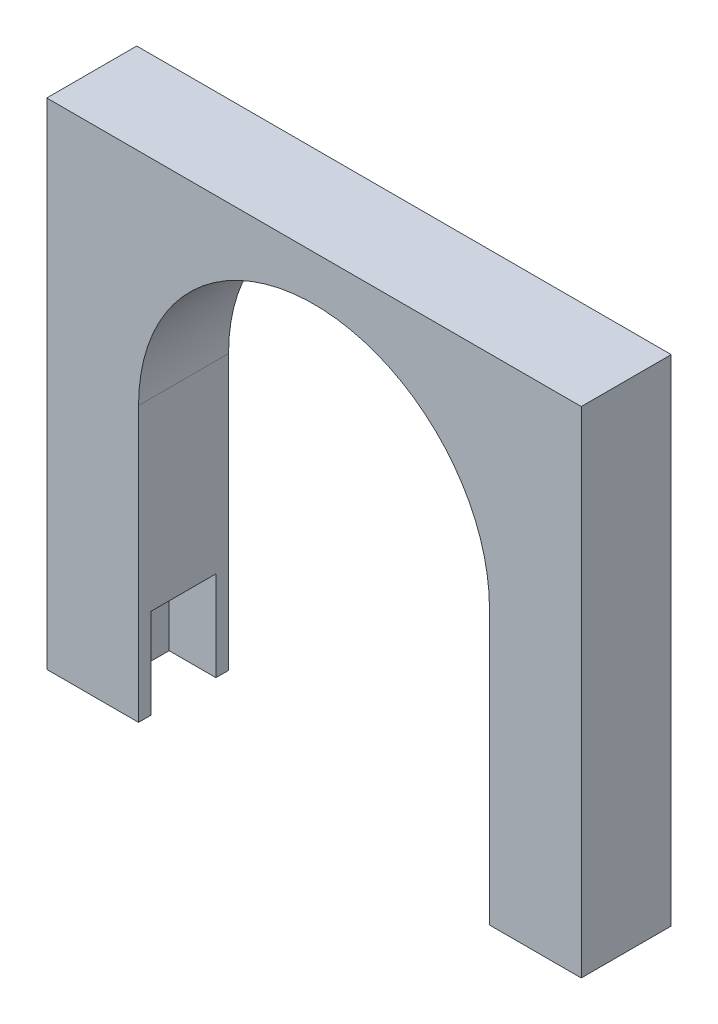
ISO-10303-21;
HEADER;
FILE_DESCRIPTION(('STEP AP214'),'2;1');
FILE_NAME('part.step','',(''),(''),'','','');
FILE_SCHEMA(('AUTOMOTIVE_DESIGN { 1 0 10303 214 1 1 1 1 }'));
ENDSEC;
DATA;
#1=APPLICATION_CONTEXT('core data for automotive mechanical design processes');
#2=APPLICATION_PROTOCOL_DEFINITION('international standard','automotive_design',2000,#1);
#3=PRODUCT_CONTEXT('',#1,'mechanical');
#4=PRODUCT('Part','Part','',(#3));
#5=PRODUCT_RELATED_PRODUCT_CATEGORY('part','',(#4));
#6=PRODUCT_DEFINITION_FORMATION('','',#4);
#7=PRODUCT_DEFINITION_CONTEXT('part definition',#1,'design');
#8=PRODUCT_DEFINITION('design','',#6,#7);
#9=PRODUCT_DEFINITION_SHAPE('','',#8);
#10=(LENGTH_UNIT() NAMED_UNIT(*) SI_UNIT(.MILLI.,.METRE.));
#11=(NAMED_UNIT(*) PLANE_ANGLE_UNIT() SI_UNIT($,.RADIAN.));
#12=(NAMED_UNIT(*) SI_UNIT($,.STERADIAN.) SOLID_ANGLE_UNIT());
#13=UNCERTAINTY_MEASURE_WITH_UNIT(LENGTH_MEASURE(1.E-05),#10,'distance_accuracy_value','');
#14=(GEOMETRIC_REPRESENTATION_CONTEXT(3) GLOBAL_UNCERTAINTY_ASSIGNED_CONTEXT((#13)) GLOBAL_UNIT_ASSIGNED_CONTEXT((#10,
#11,#12)) REPRESENTATION_CONTEXT('',''));
#15=CARTESIAN_POINT('',(0.,0.,0.));
#16=DIRECTION('',(0.,0.,1.));
#17=DIRECTION('',(1.,0.,0.));
#18=AXIS2_PLACEMENT_3D('',#15,#16,#17);
#19=CARTESIAN_POINT('',(-19.5,0.,10.));
#20=DIRECTION('',(-1.,0.,0.));
#21=DIRECTION('',(0.,0.,1.));
#22=AXIS2_PLACEMENT_3D('',#19,#20,#21);
#23=PLANE('',#22);
#24=DIRECTION('',(0.,0.,-1.));
#25=VECTOR('',#24,1.);
#26=CARTESIAN_POINT('',(-19.5,0.,10.));
#27=LINE('',#26,#25);
#28=CARTESIAN_POINT('',(-19.5,0.,10.));
#29=VERTEX_POINT('',#28);
#30=CARTESIAN_POINT('',(-19.5,0.,8.6));
#31=VERTEX_POINT('',#30);
#32=EDGE_CURVE('E241',#29,#31,#27,.T.);
#33=ORIENTED_EDGE('',*,*,#32,.T.);
#34=DIRECTION('',(0.,-1.,0.));
#35=VECTOR('',#34,1.);
#36=CARTESIAN_POINT('',(-19.5,10.,8.6));
#37=LINE('',#36,#35);
#38=CARTESIAN_POINT('',(-19.5,10.,8.6));
#39=VERTEX_POINT('',#38);
#40=EDGE_CURVE('E198',#39,#31,#37,.T.);
#41=ORIENTED_EDGE('',*,*,#40,.F.);
#42=DIRECTION('',(0.,0.,1.));
#43=VECTOR('',#42,1.);
#44=CARTESIAN_POINT('',(-19.5,10.,1.4));
#45=LINE('',#44,#43);
#46=CARTESIAN_POINT('',(-19.5,10.,1.4));
#47=VERTEX_POINT('',#46);
#48=EDGE_CURVE('E184',#47,#39,#45,.T.);
#49=ORIENTED_EDGE('',*,*,#48,.F.);
#50=DIRECTION('',(0.,-1.,0.));
#51=VECTOR('',#50,1.);
#52=CARTESIAN_POINT('',(-19.5,10.,1.4));
#53=LINE('',#52,#51);
#54=CARTESIAN_POINT('',(-19.5,0.,1.4));
#55=VERTEX_POINT('',#54);
#56=EDGE_CURVE('E200',#47,#55,#53,.T.);
#57=ORIENTED_EDGE('',*,*,#56,.T.);
#58=CARTESIAN_POINT('',(-19.5,0.,0.));
#59=VERTEX_POINT('',#58);
#60=EDGE_CURVE('E222',#55,#59,#27,.T.);
#61=ORIENTED_EDGE('',*,*,#60,.T.);
#62=DIRECTION('',(0.,1.,0.));
#63=VECTOR('',#62,1.);
#64=CARTESIAN_POINT('',(-19.5,0.,0.));
#65=LINE('',#64,#63);
#66=CARTESIAN_POINT('',(-19.5,30.5,0.));
#67=VERTEX_POINT('',#66);
#68=EDGE_CURVE('E223',#59,#67,#65,.T.);
#69=ORIENTED_EDGE('',*,*,#68,.T.);
#70=DIRECTION('',(0.,0.,-1.));
#71=VECTOR('',#70,1.);
#72=CARTESIAN_POINT('',(-19.5,30.5,10.));
#73=LINE('',#72,#71);
#74=CARTESIAN_POINT('',(-19.5,30.5,10.));
#75=VERTEX_POINT('',#74);
#76=EDGE_CURVE('E11',#75,#67,#73,.T.);
#77=ORIENTED_EDGE('',*,*,#76,.F.);
#78=DIRECTION('',(0.,1.,0.));
#79=VECTOR('',#78,1.);
#80=CARTESIAN_POINT('',(-19.5,0.,10.));
#81=LINE('',#80,#79);
#82=EDGE_CURVE('E204',#29,#75,#81,.T.);
#83=ORIENTED_EDGE('',*,*,#82,.F.);
#84=EDGE_LOOP('',(#33,#41,#49,#57,#61,#69,#77,#83));
#85=FACE_BOUND('',#84,.T.);
#86=ADVANCED_FACE('F37',(#85),#23,.F.);
#87=CARTESIAN_POINT('',(0.,30.5,10.));
#88=DIRECTION('',(0.,0.,-1.));
#89=DIRECTION('',(-1.,0.,0.));
#90=AXIS2_PLACEMENT_3D('',#87,#88,#89);
#91=CYLINDRICAL_SURFACE('',#90,19.5);
#92=CARTESIAN_POINT('',(0.,30.5,0.));
#93=DIRECTION('',(0.,0.,-1.));
#94=DIRECTION('',(1.,0.,0.));
#95=AXIS2_PLACEMENT_3D('',#92,#93,#94);
#96=CIRCLE('',#95,19.5);
#97=CARTESIAN_POINT('',(19.5,30.5,0.));
#98=VERTEX_POINT('',#97);
#99=EDGE_CURVE('E226',#67,#98,#96,.T.);
#100=ORIENTED_EDGE('',*,*,#99,.T.);
#101=DIRECTION('',(0.,0.,-1.));
#102=VECTOR('',#101,1.);
#103=CARTESIAN_POINT('',(19.5,30.5,10.));
#104=LINE('',#103,#102);
#105=CARTESIAN_POINT('',(19.5,30.5,10.));
#106=VERTEX_POINT('',#105);
#107=EDGE_CURVE('E44',#106,#98,#104,.T.);
#108=ORIENTED_EDGE('',*,*,#107,.F.);
#109=CARTESIAN_POINT('',(0.,30.5,10.));
#110=DIRECTION('',(0.,0.,-1.));
#111=DIRECTION('',(1.,0.,0.));
#112=AXIS2_PLACEMENT_3D('',#109,#110,#111);
#113=CIRCLE('',#112,19.5);
#114=EDGE_CURVE('E207',#75,#106,#113,.T.);
#115=ORIENTED_EDGE('',*,*,#114,.F.);
#116=ORIENTED_EDGE('',*,*,#76,.T.);
#117=EDGE_LOOP('',(#100,#108,#115,#116));
#118=FACE_BOUND('',#117,.T.);
#119=ADVANCED_FACE('F308',(#118),#91,.F.);
#120=CARTESIAN_POINT('',(19.5,0.,10.));
#121=DIRECTION('',(1.,0.,0.));
#122=DIRECTION('',(0.,0.,-1.));
#123=AXIS2_PLACEMENT_3D('',#120,#121,#122);
#124=PLANE('',#123);
#125=DIRECTION('',(0.,0.,-1.));
#126=VECTOR('',#125,1.);
#127=CARTESIAN_POINT('',(19.5,10.,1.4));
#128=LINE('',#127,#126);
#129=CARTESIAN_POINT('',(19.5,10.,8.6));
#130=VERTEX_POINT('',#129);
#131=CARTESIAN_POINT('',(19.5,10.,1.4));
#132=VERTEX_POINT('',#131);
#133=EDGE_CURVE('E156',#130,#132,#128,.T.);
#134=ORIENTED_EDGE('',*,*,#133,.F.);
#135=DIRECTION('',(0.,-1.,0.));
#136=VECTOR('',#135,1.);
#137=CARTESIAN_POINT('',(19.5,10.,8.6));
#138=LINE('',#137,#136);
#139=CARTESIAN_POINT('',(19.5,0.,8.6));
#140=VERTEX_POINT('',#139);
#141=EDGE_CURVE('E227',#130,#140,#138,.T.);
#142=ORIENTED_EDGE('',*,*,#141,.T.);
#143=DIRECTION('',(0.,0.,-1.));
#144=VECTOR('',#143,1.);
#145=CARTESIAN_POINT('',(19.5,0.,10.));
#146=LINE('',#145,#144);
#147=CARTESIAN_POINT('',(19.5,0.,10.));
#148=VERTEX_POINT('',#147);
#149=EDGE_CURVE('E256',#148,#140,#146,.T.);
#150=ORIENTED_EDGE('',*,*,#149,.F.);
#151=DIRECTION('',(0.,-1.,0.));
#152=VECTOR('',#151,1.);
#153=CARTESIAN_POINT('',(19.5,0.,10.));
#154=LINE('',#153,#152);
#155=EDGE_CURVE('E210',#106,#148,#154,.T.);
#156=ORIENTED_EDGE('',*,*,#155,.F.);
#157=ORIENTED_EDGE('',*,*,#107,.T.);
#158=DIRECTION('',(0.,-1.,0.));
#159=VECTOR('',#158,1.);
#160=CARTESIAN_POINT('',(19.5,0.,0.));
#161=LINE('',#160,#159);
#162=CARTESIAN_POINT('',(19.5,0.,0.));
#163=VERTEX_POINT('',#162);
#164=EDGE_CURVE('E229',#98,#163,#161,.T.);
#165=ORIENTED_EDGE('',*,*,#164,.T.);
#166=CARTESIAN_POINT('',(19.5,0.,1.4));
#167=VERTEX_POINT('',#166);
#168=EDGE_CURVE('E170',#167,#163,#146,.T.);
#169=ORIENTED_EDGE('',*,*,#168,.F.);
#170=DIRECTION('',(0.,-1.,0.));
#171=VECTOR('',#170,1.);
#172=CARTESIAN_POINT('',(19.5,10.,1.4));
#173=LINE('',#172,#171);
#174=EDGE_CURVE('E51',#132,#167,#173,.T.);
#175=ORIENTED_EDGE('',*,*,#174,.F.);
#176=EDGE_LOOP('',(#134,#142,#150,#156,#157,#165,#169,#175));
#177=FACE_BOUND('',#176,.T.);
#178=ADVANCED_FACE('F168',(#177),#124,.F.);
#179=CARTESIAN_POINT('',(29.7,0.,10.));
#180=DIRECTION('',(0.,1.,0.));
#181=DIRECTION('',(-1.,0.,0.));
#182=AXIS2_PLACEMENT_3D('',#179,#180,#181);
#183=PLANE('',#182);
#184=ORIENTED_EDGE('',*,*,#149,.T.);
#185=DIRECTION('',(-1.,0.,0.));
#186=VECTOR('',#185,1.);
#187=CARTESIAN_POINT('',(19.5,0.,8.6));
#188=LINE('',#187,#186);
#189=CARTESIAN_POINT('',(24.7,0.,8.6));
#190=VERTEX_POINT('',#189);
#191=EDGE_CURVE('E165',#190,#140,#188,.T.);
#192=ORIENTED_EDGE('',*,*,#191,.F.);
#193=DIRECTION('',(0.,0.,1.));
#194=VECTOR('',#193,1.);
#195=CARTESIAN_POINT('',(24.7,0.,8.6));
#196=LINE('',#195,#194);
#197=CARTESIAN_POINT('',(24.7,0.,1.4));
#198=VERTEX_POINT('',#197);
#199=EDGE_CURVE('E288',#198,#190,#196,.T.);
#200=ORIENTED_EDGE('',*,*,#199,.F.);
#201=DIRECTION('',(1.,0.,0.));
#202=VECTOR('',#201,1.);
#203=CARTESIAN_POINT('',(24.7,0.,1.4));
#204=LINE('',#203,#202);
#205=EDGE_CURVE('E197',#167,#198,#204,.T.);
#206=ORIENTED_EDGE('',*,*,#205,.F.);
#207=ORIENTED_EDGE('',*,*,#168,.T.);
#208=DIRECTION('',(1.,0.,0.));
#209=VECTOR('',#208,1.);
#210=CARTESIAN_POINT('',(29.7,0.,0.));
#211=LINE('',#210,#209);
#212=CARTESIAN_POINT('',(29.7,0.,0.));
#213=VERTEX_POINT('',#212);
#214=EDGE_CURVE('E231',#163,#213,#211,.T.);
#215=ORIENTED_EDGE('',*,*,#214,.T.);
#216=DIRECTION('',(0.,0.,-1.));
#217=VECTOR('',#216,1.);
#218=CARTESIAN_POINT('',(29.7,0.,10.));
#219=LINE('',#218,#217);
#220=CARTESIAN_POINT('',(29.7,0.,10.));
#221=VERTEX_POINT('',#220);
#222=EDGE_CURVE('E253',#221,#213,#219,.T.);
#223=ORIENTED_EDGE('',*,*,#222,.F.);
#224=DIRECTION('',(1.,0.,0.));
#225=VECTOR('',#224,1.);
#226=CARTESIAN_POINT('',(29.7,0.,10.));
#227=LINE('',#226,#225);
#228=EDGE_CURVE('E212',#148,#221,#227,.T.);
#229=ORIENTED_EDGE('',*,*,#228,.F.);
#230=EDGE_LOOP('',(#184,#192,#200,#206,#207,#215,#223,#229));
#231=FACE_BOUND('',#230,.T.);
#232=ADVANCED_FACE('F272',(#231),#183,.F.);
#233=CARTESIAN_POINT('',(29.7,55.,10.));
#234=DIRECTION('',(-1.,0.,0.));
#235=DIRECTION('',(0.,0.,1.));
#236=AXIS2_PLACEMENT_3D('',#233,#234,#235);
#237=PLANE('',#236);
#238=DIRECTION('',(0.,1.,0.));
#239=VECTOR('',#238,1.);
#240=CARTESIAN_POINT('',(29.7,55.,0.));
#241=LINE('',#240,#239);
#242=CARTESIAN_POINT('',(29.7,55.,0.));
#243=VERTEX_POINT('',#242);
#244=EDGE_CURVE('E233',#213,#243,#241,.T.);
#245=ORIENTED_EDGE('',*,*,#244,.T.);
#246=DIRECTION('',(0.,0.,-1.));
#247=VECTOR('',#246,1.);
#248=CARTESIAN_POINT('',(29.7,55.,10.));
#249=LINE('',#248,#247);
#250=CARTESIAN_POINT('',(29.7,55.,10.));
#251=VERTEX_POINT('',#250);
#252=EDGE_CURVE('E250',#251,#243,#249,.T.);
#253=ORIENTED_EDGE('',*,*,#252,.F.);
#254=DIRECTION('',(0.,1.,0.));
#255=VECTOR('',#254,1.);
#256=CARTESIAN_POINT('',(29.7,55.,10.));
#257=LINE('',#256,#255);
#258=EDGE_CURVE('E214',#221,#251,#257,.T.);
#259=ORIENTED_EDGE('',*,*,#258,.F.);
#260=ORIENTED_EDGE('',*,*,#222,.T.);
#261=EDGE_LOOP('',(#245,#253,#259,#260));
#262=FACE_BOUND('',#261,.T.);
#263=ADVANCED_FACE('F276',(#262),#237,.F.);
#264=CARTESIAN_POINT('',(-29.7,55.,10.));
#265=DIRECTION('',(0.,-1.,0.));
#266=DIRECTION('',(0.,0.,-1.));
#267=AXIS2_PLACEMENT_3D('',#264,#265,#266);
#268=PLANE('',#267);
#269=DIRECTION('',(-1.,0.,0.));
#270=VECTOR('',#269,1.);
#271=CARTESIAN_POINT('',(-29.7,55.,0.));
#272=LINE('',#271,#270);
#273=CARTESIAN_POINT('',(-29.7,55.,0.));
#274=VERTEX_POINT('',#273);
#275=EDGE_CURVE('E235',#243,#274,#272,.T.);
#276=ORIENTED_EDGE('',*,*,#275,.T.);
#277=DIRECTION('',(0.,0.,-1.));
#278=VECTOR('',#277,1.);
#279=CARTESIAN_POINT('',(-29.7,55.,10.));
#280=LINE('',#279,#278);
#281=CARTESIAN_POINT('',(-29.7,55.,10.));
#282=VERTEX_POINT('',#281);
#283=EDGE_CURVE('E247',#282,#274,#280,.T.);
#284=ORIENTED_EDGE('',*,*,#283,.F.);
#285=DIRECTION('',(-1.,0.,0.));
#286=VECTOR('',#285,1.);
#287=CARTESIAN_POINT('',(-29.7,55.,10.));
#288=LINE('',#287,#286);
#289=EDGE_CURVE('E216',#251,#282,#288,.T.);
#290=ORIENTED_EDGE('',*,*,#289,.F.);
#291=ORIENTED_EDGE('',*,*,#252,.T.);
#292=EDGE_LOOP('',(#276,#284,#290,#291));
#293=FACE_BOUND('',#292,.T.);
#294=ADVANCED_FACE('F339',(#293),#268,.F.);
#295=CARTESIAN_POINT('',(-29.7,0.,10.));
#296=DIRECTION('',(1.,0.,0.));
#297=DIRECTION('',(0.,0.,-1.));
#298=AXIS2_PLACEMENT_3D('',#295,#296,#297);
#299=PLANE('',#298);
#300=DIRECTION('',(0.,-1.,0.));
#301=VECTOR('',#300,1.);
#302=CARTESIAN_POINT('',(-29.7,0.,0.));
#303=LINE('',#302,#301);
#304=CARTESIAN_POINT('',(-29.7,0.,0.));
#305=VERTEX_POINT('',#304);
#306=EDGE_CURVE('E237',#274,#305,#303,.T.);
#307=ORIENTED_EDGE('',*,*,#306,.T.);
#308=DIRECTION('',(0.,0.,-1.));
#309=VECTOR('',#308,1.);
#310=CARTESIAN_POINT('',(-29.7,0.,10.));
#311=LINE('',#310,#309);
#312=CARTESIAN_POINT('',(-29.7,0.,10.));
#313=VERTEX_POINT('',#312);
#314=EDGE_CURVE('E244',#313,#305,#311,.T.);
#315=ORIENTED_EDGE('',*,*,#314,.F.);
#316=DIRECTION('',(0.,-1.,0.));
#317=VECTOR('',#316,1.);
#318=CARTESIAN_POINT('',(-29.7,0.,10.));
#319=LINE('',#318,#317);
#320=EDGE_CURVE('E218',#282,#313,#319,.T.);
#321=ORIENTED_EDGE('',*,*,#320,.F.);
#322=ORIENTED_EDGE('',*,*,#283,.T.);
#323=EDGE_LOOP('',(#307,#315,#321,#322));
#324=FACE_BOUND('',#323,.T.);
#325=ADVANCED_FACE('F337',(#324),#299,.F.);
#326=CARTESIAN_POINT('',(-19.5,0.,10.));
#327=DIRECTION('',(0.,1.,0.));
#328=DIRECTION('',(-1.,0.,0.));
#329=AXIS2_PLACEMENT_3D('',#326,#327,#328);
#330=PLANE('',#329);
#331=DIRECTION('',(0.,0.,-1.));
#332=VECTOR('',#331,1.);
#333=CARTESIAN_POINT('',(-24.7,0.,8.6));
#334=LINE('',#333,#332);
#335=CARTESIAN_POINT('',(-24.7,0.,8.6));
#336=VERTEX_POINT('',#335);
#337=CARTESIAN_POINT('',(-24.7,0.,1.4));
#338=VERTEX_POINT('',#337);
#339=EDGE_CURVE('E59',#336,#338,#334,.T.);
#340=ORIENTED_EDGE('',*,*,#339,.F.);
#341=DIRECTION('',(-1.,0.,0.));
#342=VECTOR('',#341,1.);
#343=CARTESIAN_POINT('',(-19.5,0.,8.6));
#344=LINE('',#343,#342);
#345=EDGE_CURVE('E181',#31,#336,#344,.T.);
#346=ORIENTED_EDGE('',*,*,#345,.F.);
#347=ORIENTED_EDGE('',*,*,#32,.F.);
#348=DIRECTION('',(1.,0.,0.));
#349=VECTOR('',#348,1.);
#350=CARTESIAN_POINT('',(-19.5,0.,10.));
#351=LINE('',#350,#349);
#352=EDGE_CURVE('E220',#313,#29,#351,.T.);
#353=ORIENTED_EDGE('',*,*,#352,.F.);
#354=ORIENTED_EDGE('',*,*,#314,.T.);
#355=DIRECTION('',(1.,0.,0.));
#356=VECTOR('',#355,1.);
#357=CARTESIAN_POINT('',(-19.5,0.,0.));
#358=LINE('',#357,#356);
#359=EDGE_CURVE('E208',#305,#59,#358,.T.);
#360=ORIENTED_EDGE('',*,*,#359,.T.);
#361=ORIENTED_EDGE('',*,*,#60,.F.);
#362=DIRECTION('',(1.,0.,0.));
#363=VECTOR('',#362,1.);
#364=CARTESIAN_POINT('',(-24.7,0.,1.4));
#365=LINE('',#364,#363);
#366=EDGE_CURVE('E191',#338,#55,#365,.T.);
#367=ORIENTED_EDGE('',*,*,#366,.F.);
#368=EDGE_LOOP('',(#340,#346,#347,#353,#354,#360,#361,#367));
#369=FACE_BOUND('',#368,.T.);
#370=ADVANCED_FACE('F323',(#369),#330,.F.);
#371=CARTESIAN_POINT('',(0.,30.5,10.));
#372=DIRECTION('',(0.,0.,1.));
#373=DIRECTION('',(1.,0.,0.));
#374=AXIS2_PLACEMENT_3D('',#371,#372,#373);
#375=PLANE('',#374);
#376=ORIENTED_EDGE('',*,*,#82,.T.);
#377=ORIENTED_EDGE('',*,*,#114,.T.);
#378=ORIENTED_EDGE('',*,*,#155,.T.);
#379=ORIENTED_EDGE('',*,*,#228,.T.);
#380=ORIENTED_EDGE('',*,*,#258,.T.);
#381=ORIENTED_EDGE('',*,*,#289,.T.);
#382=ORIENTED_EDGE('',*,*,#320,.T.);
#383=ORIENTED_EDGE('',*,*,#352,.T.);
#384=EDGE_LOOP('',(#376,#377,#378,#379,#380,#381,#382,#383));
#385=FACE_BOUND('',#384,.T.);
#386=ADVANCED_FACE('F280',(#385),#375,.T.);
#387=CARTESIAN_POINT('',(0.,30.5,0.));
#388=DIRECTION('',(0.,0.,1.));
#389=DIRECTION('',(1.,0.,0.));
#390=AXIS2_PLACEMENT_3D('',#387,#388,#389);
#391=PLANE('',#390);
#392=ORIENTED_EDGE('',*,*,#68,.F.);
#393=ORIENTED_EDGE('',*,*,#359,.F.);
#394=ORIENTED_EDGE('',*,*,#306,.F.);
#395=ORIENTED_EDGE('',*,*,#275,.F.);
#396=ORIENTED_EDGE('',*,*,#244,.F.);
#397=ORIENTED_EDGE('',*,*,#214,.F.);
#398=ORIENTED_EDGE('',*,*,#164,.F.);
#399=ORIENTED_EDGE('',*,*,#99,.F.);
#400=EDGE_LOOP('',(#392,#393,#394,#395,#396,#397,#398,#399));
#401=FACE_BOUND('',#400,.T.);
#402=ADVANCED_FACE('F267',(#401),#391,.F.);
#403=CARTESIAN_POINT('',(-24.7,10.,8.6));
#404=DIRECTION('',(-1.,0.,0.));
#405=DIRECTION('',(0.,0.,1.));
#406=AXIS2_PLACEMENT_3D('',#403,#404,#405);
#407=PLANE('',#406);
#408=ORIENTED_EDGE('',*,*,#339,.T.);
#409=DIRECTION('',(0.,-1.,0.));
#410=VECTOR('',#409,1.);
#411=CARTESIAN_POINT('',(-24.7,10.,1.4));
#412=LINE('',#411,#410);
#413=CARTESIAN_POINT('',(-24.7,10.,1.4));
#414=VERTEX_POINT('',#413);
#415=EDGE_CURVE('E189',#414,#338,#412,.T.);
#416=ORIENTED_EDGE('',*,*,#415,.F.);
#417=DIRECTION('',(0.,0.,-1.));
#418=VECTOR('',#417,1.);
#419=CARTESIAN_POINT('',(-24.7,10.,8.6));
#420=LINE('',#419,#418);
#421=CARTESIAN_POINT('',(-24.7,10.,8.6));
#422=VERTEX_POINT('',#421);
#423=EDGE_CURVE('E177',#422,#414,#420,.T.);
#424=ORIENTED_EDGE('',*,*,#423,.F.);
#425=DIRECTION('',(0.,-1.,0.));
#426=VECTOR('',#425,1.);
#427=CARTESIAN_POINT('',(-24.7,10.,8.6));
#428=LINE('',#427,#426);
#429=EDGE_CURVE('E195',#422,#336,#428,.T.);
#430=ORIENTED_EDGE('',*,*,#429,.T.);
#431=EDGE_LOOP('',(#408,#416,#424,#430));
#432=FACE_BOUND('',#431,.T.);
#433=ADVANCED_FACE('F370',(#432),#407,.F.);
#434=CARTESIAN_POINT('',(-19.5,10.,8.6));
#435=DIRECTION('',(0.,0.,1.));
#436=DIRECTION('',(1.,0.,0.));
#437=AXIS2_PLACEMENT_3D('',#434,#435,#436);
#438=PLANE('',#437);
#439=ORIENTED_EDGE('',*,*,#345,.T.);
#440=ORIENTED_EDGE('',*,*,#429,.F.);
#441=DIRECTION('',(-1.,0.,0.));
#442=VECTOR('',#441,1.);
#443=CARTESIAN_POINT('',(-19.5,10.,8.6));
#444=LINE('',#443,#442);
#445=EDGE_CURVE('E186',#39,#422,#444,.T.);
#446=ORIENTED_EDGE('',*,*,#445,.F.);
#447=ORIENTED_EDGE('',*,*,#40,.T.);
#448=EDGE_LOOP('',(#439,#440,#446,#447));
#449=FACE_BOUND('',#448,.T.);
#450=ADVANCED_FACE('F326',(#449),#438,.F.);
#451=CARTESIAN_POINT('',(-24.7,10.,1.4));
#452=DIRECTION('',(0.,0.,-1.));
#453=DIRECTION('',(-1.,0.,0.));
#454=AXIS2_PLACEMENT_3D('',#451,#452,#453);
#455=PLANE('',#454);
#456=ORIENTED_EDGE('',*,*,#366,.T.);
#457=ORIENTED_EDGE('',*,*,#56,.F.);
#458=DIRECTION('',(1.,0.,0.));
#459=VECTOR('',#458,1.);
#460=CARTESIAN_POINT('',(-24.7,10.,1.4));
#461=LINE('',#460,#459);
#462=EDGE_CURVE('E180',#414,#47,#461,.T.);
#463=ORIENTED_EDGE('',*,*,#462,.F.);
#464=ORIENTED_EDGE('',*,*,#415,.T.);
#465=EDGE_LOOP('',(#456,#457,#463,#464));
#466=FACE_BOUND('',#465,.T.);
#467=ADVANCED_FACE('F303',(#466),#455,.F.);
#468=CARTESIAN_POINT('',(0.,10.,0.));
#469=DIRECTION('',(0.,-1.,0.));
#470=DIRECTION('',(1.,0.,0.));
#471=AXIS2_PLACEMENT_3D('',#468,#469,#470);
#472=PLANE('',#471);
#473=ORIENTED_EDGE('',*,*,#423,.T.);
#474=ORIENTED_EDGE('',*,*,#462,.T.);
#475=ORIENTED_EDGE('',*,*,#48,.T.);
#476=ORIENTED_EDGE('',*,*,#445,.T.);
#477=EDGE_LOOP('',(#473,#474,#475,#476));
#478=FACE_BOUND('',#477,.T.);
#479=ADVANCED_FACE('F296',(#478),#472,.T.);
#480=CARTESIAN_POINT('',(19.5,10.,8.6));
#481=DIRECTION('',(0.,0.,1.));
#482=DIRECTION('',(1.,0.,0.));
#483=AXIS2_PLACEMENT_3D('',#480,#481,#482);
#484=PLANE('',#483);
#485=ORIENTED_EDGE('',*,*,#191,.T.);
#486=ORIENTED_EDGE('',*,*,#141,.F.);
#487=DIRECTION('',(-1.,0.,0.));
#488=VECTOR('',#487,1.);
#489=CARTESIAN_POINT('',(19.5,10.,8.6));
#490=LINE('',#489,#488);
#491=CARTESIAN_POINT('',(24.7,10.,8.6));
#492=VERTEX_POINT('',#491);
#493=EDGE_CURVE('E162',#492,#130,#490,.T.);
#494=ORIENTED_EDGE('',*,*,#493,.F.);
#495=DIRECTION('',(0.,-1.,0.));
#496=VECTOR('',#495,1.);
#497=CARTESIAN_POINT('',(24.7,10.,8.6));
#498=LINE('',#497,#496);
#499=EDGE_CURVE('E172',#492,#190,#498,.T.);
#500=ORIENTED_EDGE('',*,*,#499,.T.);
#501=EDGE_LOOP('',(#485,#486,#494,#500));
#502=FACE_BOUND('',#501,.T.);
#503=ADVANCED_FACE('F294',(#502),#484,.F.);
#504=CARTESIAN_POINT('',(24.7,10.,8.6));
#505=DIRECTION('',(1.,0.,0.));
#506=DIRECTION('',(0.,0.,-1.));
#507=AXIS2_PLACEMENT_3D('',#504,#505,#506);
#508=PLANE('',#507);
#509=ORIENTED_EDGE('',*,*,#199,.T.);
#510=ORIENTED_EDGE('',*,*,#499,.F.);
#511=DIRECTION('',(0.,0.,1.));
#512=VECTOR('',#511,1.);
#513=CARTESIAN_POINT('',(24.7,10.,8.6));
#514=LINE('',#513,#512);
#515=CARTESIAN_POINT('',(24.7,10.,1.4));
#516=VERTEX_POINT('',#515);
#517=EDGE_CURVE('E155',#516,#492,#514,.T.);
#518=ORIENTED_EDGE('',*,*,#517,.F.);
#519=DIRECTION('',(0.,-1.,0.));
#520=VECTOR('',#519,1.);
#521=CARTESIAN_POINT('',(24.7,10.,1.4));
#522=LINE('',#521,#520);
#523=EDGE_CURVE('E151',#516,#198,#522,.T.);
#524=ORIENTED_EDGE('',*,*,#523,.T.);
#525=EDGE_LOOP('',(#509,#510,#518,#524));
#526=FACE_BOUND('',#525,.T.);
#527=ADVANCED_FACE('F293',(#526),#508,.F.);
#528=CARTESIAN_POINT('',(24.7,10.,1.4));
#529=DIRECTION('',(0.,0.,-1.));
#530=DIRECTION('',(-1.,0.,0.));
#531=AXIS2_PLACEMENT_3D('',#528,#529,#530);
#532=PLANE('',#531);
#533=ORIENTED_EDGE('',*,*,#205,.T.);
#534=ORIENTED_EDGE('',*,*,#523,.F.);
#535=DIRECTION('',(1.,0.,0.));
#536=VECTOR('',#535,1.);
#537=CARTESIAN_POINT('',(24.7,10.,1.4));
#538=LINE('',#537,#536);
#539=EDGE_CURVE('E148',#132,#516,#538,.T.);
#540=ORIENTED_EDGE('',*,*,#539,.F.);
#541=ORIENTED_EDGE('',*,*,#174,.T.);
#542=EDGE_LOOP('',(#533,#534,#540,#541));
#543=FACE_BOUND('',#542,.T.);
#544=ADVANCED_FACE('F150',(#543),#532,.F.);
#545=CARTESIAN_POINT('',(0.,10.,0.));
#546=DIRECTION('',(0.,1.,0.));
#547=DIRECTION('',(-1.,0.,0.));
#548=AXIS2_PLACEMENT_3D('',#545,#546,#547);
#549=PLANE('',#548);
#550=ORIENTED_EDGE('',*,*,#133,.T.);
#551=ORIENTED_EDGE('',*,*,#539,.T.);
#552=ORIENTED_EDGE('',*,*,#517,.T.);
#553=ORIENTED_EDGE('',*,*,#493,.T.);
#554=EDGE_LOOP('',(#550,#551,#552,#553));
#555=FACE_BOUND('',#554,.T.);
#556=ADVANCED_FACE('F160',(#555),#549,.F.);
#557=CLOSED_SHELL('',(#86,#119,#178,#232,#263,#294,#325,#370,#386,#402,#433,#450,#467,#479,#503,
#527,#544,#556));
#558=MANIFOLD_SOLID_BREP('B2',#557);
#559=ADVANCED_BREP_SHAPE_REPRESENTATION('',(#18,#558),#14);
#560=SHAPE_DEFINITION_REPRESENTATION(#9,#559);
ENDSEC;
END-ISO-10303-21;
